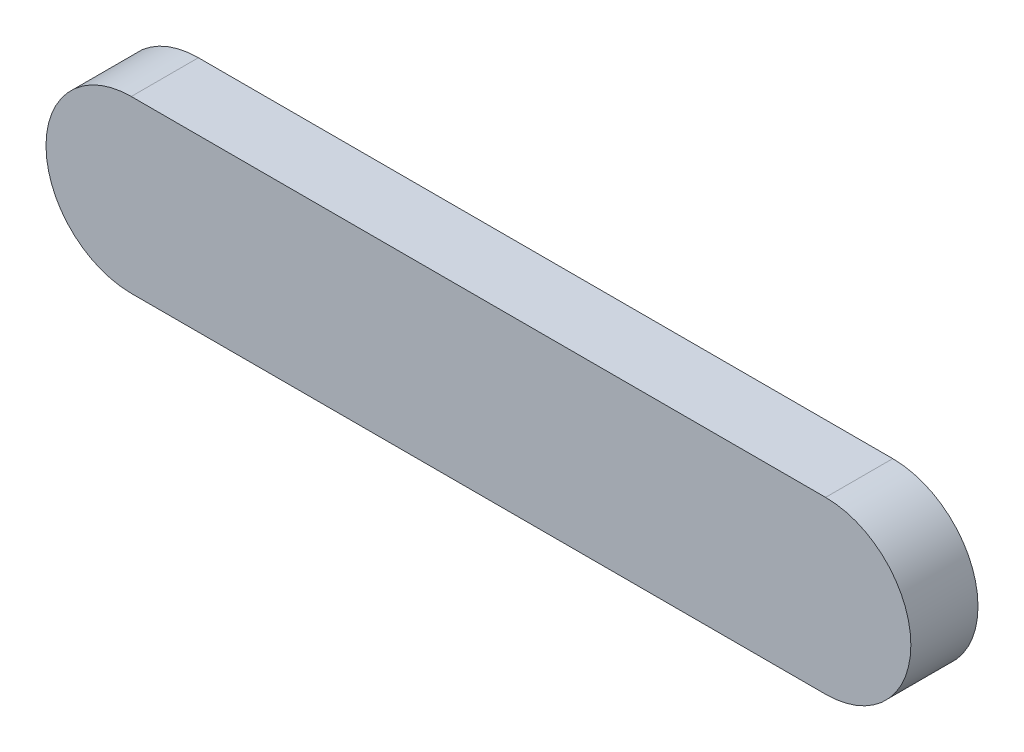
ISO-10303-21;
HEADER;
FILE_DESCRIPTION(('STEP AP214'),'2;1');
FILE_NAME('part.step','',(''),(''),'','','');
FILE_SCHEMA(('AUTOMOTIVE_DESIGN { 1 0 10303 214 1 1 1 1 }'));
ENDSEC;
DATA;
#1=APPLICATION_CONTEXT('core data for automotive mechanical design processes');
#2=APPLICATION_PROTOCOL_DEFINITION('international standard','automotive_design',2000,#1);
#3=PRODUCT_CONTEXT('',#1,'mechanical');
#4=PRODUCT('Part','Part','',(#3));
#5=PRODUCT_RELATED_PRODUCT_CATEGORY('part','',(#4));
#6=PRODUCT_DEFINITION_FORMATION('','',#4);
#7=PRODUCT_DEFINITION_CONTEXT('part definition',#1,'design');
#8=PRODUCT_DEFINITION('design','',#6,#7);
#9=PRODUCT_DEFINITION_SHAPE('','',#8);
#10=(LENGTH_UNIT() NAMED_UNIT(*) SI_UNIT(.MILLI.,.METRE.));
#11=(NAMED_UNIT(*) PLANE_ANGLE_UNIT() SI_UNIT($,.RADIAN.));
#12=(NAMED_UNIT(*) SI_UNIT($,.STERADIAN.) SOLID_ANGLE_UNIT());
#13=UNCERTAINTY_MEASURE_WITH_UNIT(LENGTH_MEASURE(1.E-05),#10,'distance_accuracy_value','');
#14=(GEOMETRIC_REPRESENTATION_CONTEXT(3) GLOBAL_UNCERTAINTY_ASSIGNED_CONTEXT((#13)) GLOBAL_UNIT_ASSIGNED_CONTEXT((#10,
#11,#12)) REPRESENTATION_CONTEXT('',''));
#15=CARTESIAN_POINT('',(0.,0.,0.));
#16=DIRECTION('',(0.,0.,1.));
#17=DIRECTION('',(1.,0.,0.));
#18=AXIS2_PLACEMENT_3D('',#15,#16,#17);
#19=CARTESIAN_POINT('',(138.811,59.817,0.));
#20=DIRECTION('',(0.,1.,0.));
#21=DIRECTION('',(1.,0.,0.));
#22=AXIS2_PLACEMENT_3D('',#19,#20,#21);
#23=PLANE('',#22);
#24=DIRECTION('',(1.,0.,0.));
#25=VECTOR('',#24,1.);
#26=CARTESIAN_POINT('',(138.811,59.817,0.1999996));
#27=LINE('',#26,#25);
#28=CARTESIAN_POINT('',(138.811,59.817,0.1999996));
#29=VERTEX_POINT('',#28);
#30=CARTESIAN_POINT('',(140.8795252,59.817,0.1999996));
#31=VERTEX_POINT('',#30);
#32=EDGE_CURVE('E11',#29,#31,#27,.T.);
#33=ORIENTED_EDGE('',*,*,#32,.F.);
#34=DIRECTION('',(0.,0.,1.));
#35=VECTOR('',#34,1.);
#36=CARTESIAN_POINT('',(138.811,59.817,0.));
#37=LINE('',#36,#35);
#38=CARTESIAN_POINT('',(138.811,59.817,0.));
#39=VERTEX_POINT('',#38);
#40=EDGE_CURVE('E24',#39,#29,#37,.T.);
#41=ORIENTED_EDGE('',*,*,#40,.F.);
#42=DIRECTION('',(1.,0.,0.));
#43=VECTOR('',#42,1.);
#44=CARTESIAN_POINT('',(138.811,59.817,0.));
#45=LINE('',#44,#43);
#46=CARTESIAN_POINT('',(140.8795252,59.817,0.));
#47=VERTEX_POINT('',#46);
#48=EDGE_CURVE('E75',#39,#47,#45,.T.);
#49=ORIENTED_EDGE('',*,*,#48,.T.);
#50=DIRECTION('',(0.,0.,1.));
#51=VECTOR('',#50,1.);
#52=CARTESIAN_POINT('',(140.8795252,59.817,0.));
#53=LINE('',#52,#51);
#54=EDGE_CURVE('E37',#47,#31,#53,.T.);
#55=ORIENTED_EDGE('',*,*,#54,.T.);
#56=EDGE_LOOP('',(#33,#41,#49,#55));
#57=FACE_BOUND('',#56,.T.);
#58=ADVANCED_FACE('F17',(#57),#23,.F.);
#59=CARTESIAN_POINT('',(140.8795252,60.071,0.));
#60=DIRECTION('',(0.,0.,-1.));
#61=DIRECTION('',(0.,-1.,0.));
#62=AXIS2_PLACEMENT_3D('',#59,#60,#61);
#63=CYLINDRICAL_SURFACE('',#62,0.253999999999998);
#64=CARTESIAN_POINT('',(140.8795252,60.071,0.1999996));
#65=DIRECTION('',(0.,0.,1.));
#66=DIRECTION('',(0.,-1.,0.));
#67=AXIS2_PLACEMENT_3D('',#64,#65,#66);
#68=CIRCLE('',#67,0.253999999999998);
#69=CARTESIAN_POINT('',(140.8795252,60.325,0.1999996));
#70=VERTEX_POINT('',#69);
#71=EDGE_CURVE('E83',#31,#70,#68,.T.);
#72=ORIENTED_EDGE('',*,*,#71,.F.);
#73=ORIENTED_EDGE('',*,*,#54,.F.);
#74=CARTESIAN_POINT('',(140.8795252,60.071,0.));
#75=DIRECTION('',(0.,0.,1.));
#76=DIRECTION('',(0.,-1.,0.));
#77=AXIS2_PLACEMENT_3D('',#74,#75,#76);
#78=CIRCLE('',#77,0.253999999999998);
#79=CARTESIAN_POINT('',(140.8795252,60.325,0.));
#80=VERTEX_POINT('',#79);
#81=EDGE_CURVE('E81',#47,#80,#78,.T.);
#82=ORIENTED_EDGE('',*,*,#81,.T.);
#83=DIRECTION('',(0.,0.,1.));
#84=VECTOR('',#83,1.);
#85=CARTESIAN_POINT('',(140.8795252,60.325,0.));
#86=LINE('',#85,#84);
#87=EDGE_CURVE('E67',#80,#70,#86,.T.);
#88=ORIENTED_EDGE('',*,*,#87,.T.);
#89=EDGE_LOOP('',(#72,#73,#82,#88));
#90=FACE_BOUND('',#89,.T.);
#91=ADVANCED_FACE('F89',(#90),#63,.T.);
#92=CARTESIAN_POINT('',(140.8795252,60.325,0.));
#93=DIRECTION('',(0.,-1.,0.));
#94=DIRECTION('',(-1.,0.,0.));
#95=AXIS2_PLACEMENT_3D('',#92,#93,#94);
#96=PLANE('',#95);
#97=DIRECTION('',(-1.,0.,0.));
#98=VECTOR('',#97,1.);
#99=CARTESIAN_POINT('',(140.8795252,60.325,0.1999996));
#100=LINE('',#99,#98);
#101=CARTESIAN_POINT('',(138.811,60.325,0.1999996));
#102=VERTEX_POINT('',#101);
#103=EDGE_CURVE('E71',#70,#102,#100,.T.);
#104=ORIENTED_EDGE('',*,*,#103,.F.);
#105=ORIENTED_EDGE('',*,*,#87,.F.);
#106=DIRECTION('',(-1.,0.,0.));
#107=VECTOR('',#106,1.);
#108=CARTESIAN_POINT('',(140.8795252,60.325,0.));
#109=LINE('',#108,#107);
#110=CARTESIAN_POINT('',(138.811,60.325,0.));
#111=VERTEX_POINT('',#110);
#112=EDGE_CURVE('E63',#80,#111,#109,.T.);
#113=ORIENTED_EDGE('',*,*,#112,.T.);
#114=DIRECTION('',(0.,0.,1.));
#115=VECTOR('',#114,1.);
#116=CARTESIAN_POINT('',(138.811,60.325,0.));
#117=LINE('',#116,#115);
#118=EDGE_CURVE('E53',#111,#102,#117,.T.);
#119=ORIENTED_EDGE('',*,*,#118,.T.);
#120=EDGE_LOOP('',(#104,#105,#113,#119));
#121=FACE_BOUND('',#120,.T.);
#122=ADVANCED_FACE('F66',(#121),#96,.F.);
#123=CARTESIAN_POINT('',(138.811,60.071,0.));
#124=DIRECTION('',(0.,0.,-1.));
#125=DIRECTION('',(1.11896493820489E-13,1.,0.));
#126=AXIS2_PLACEMENT_3D('',#123,#124,#125);
#127=CYLINDRICAL_SURFACE('',#126,0.253999999999998);
#128=CARTESIAN_POINT('',(138.811,60.071,0.1999996));
#129=DIRECTION('',(0.,0.,1.));
#130=DIRECTION('',(1.11896493820489E-13,1.,0.));
#131=AXIS2_PLACEMENT_3D('',#128,#129,#130);
#132=CIRCLE('',#131,0.253999999999998);
#133=EDGE_CURVE('E59',#102,#29,#132,.T.);
#134=ORIENTED_EDGE('',*,*,#133,.F.);
#135=ORIENTED_EDGE('',*,*,#118,.F.);
#136=CARTESIAN_POINT('',(138.811,60.071,0.));
#137=DIRECTION('',(0.,0.,1.));
#138=DIRECTION('',(1.11896493820489E-13,1.,0.));
#139=AXIS2_PLACEMENT_3D('',#136,#137,#138);
#140=CIRCLE('',#139,0.253999999999998);
#141=EDGE_CURVE('E57',#111,#39,#140,.T.);
#142=ORIENTED_EDGE('',*,*,#141,.T.);
#143=ORIENTED_EDGE('',*,*,#40,.T.);
#144=EDGE_LOOP('',(#134,#135,#142,#143));
#145=FACE_BOUND('',#144,.T.);
#146=ADVANCED_FACE('F55',(#145),#127,.T.);
#147=CARTESIAN_POINT('',(138.811,59.817,0.));
#148=DIRECTION('',(0.,0.,-1.));
#149=DIRECTION('',(-1.,0.,0.));
#150=AXIS2_PLACEMENT_3D('',#147,#148,#149);
#151=PLANE('',#150);
#152=ORIENTED_EDGE('',*,*,#141,.F.);
#153=ORIENTED_EDGE('',*,*,#112,.F.);
#154=ORIENTED_EDGE('',*,*,#81,.F.);
#155=ORIENTED_EDGE('',*,*,#48,.F.);
#156=EDGE_LOOP('',(#152,#153,#154,#155));
#157=FACE_BOUND('',#156,.T.);
#158=ADVANCED_FACE('F74',(#157),#151,.T.);
#159=CARTESIAN_POINT('',(138.811,59.817,0.1999996));
#160=DIRECTION('',(0.,0.,-1.));
#161=DIRECTION('',(-1.,0.,0.));
#162=AXIS2_PLACEMENT_3D('',#159,#160,#161);
#163=PLANE('',#162);
#164=ORIENTED_EDGE('',*,*,#32,.T.);
#165=ORIENTED_EDGE('',*,*,#71,.T.);
#166=ORIENTED_EDGE('',*,*,#103,.T.);
#167=ORIENTED_EDGE('',*,*,#133,.T.);
#168=EDGE_LOOP('',(#164,#165,#166,#167));
#169=FACE_BOUND('',#168,.T.);
#170=ADVANCED_FACE('F91',(#169),#163,.F.);
#171=CLOSED_SHELL('',(#58,#91,#122,#146,#158,#170));
#172=MANIFOLD_SOLID_BREP('B1',#171);
#173=ADVANCED_BREP_SHAPE_REPRESENTATION('',(#18,#172),#14);
#174=SHAPE_DEFINITION_REPRESENTATION(#9,#173);
ENDSEC;
END-ISO-10303-21;
